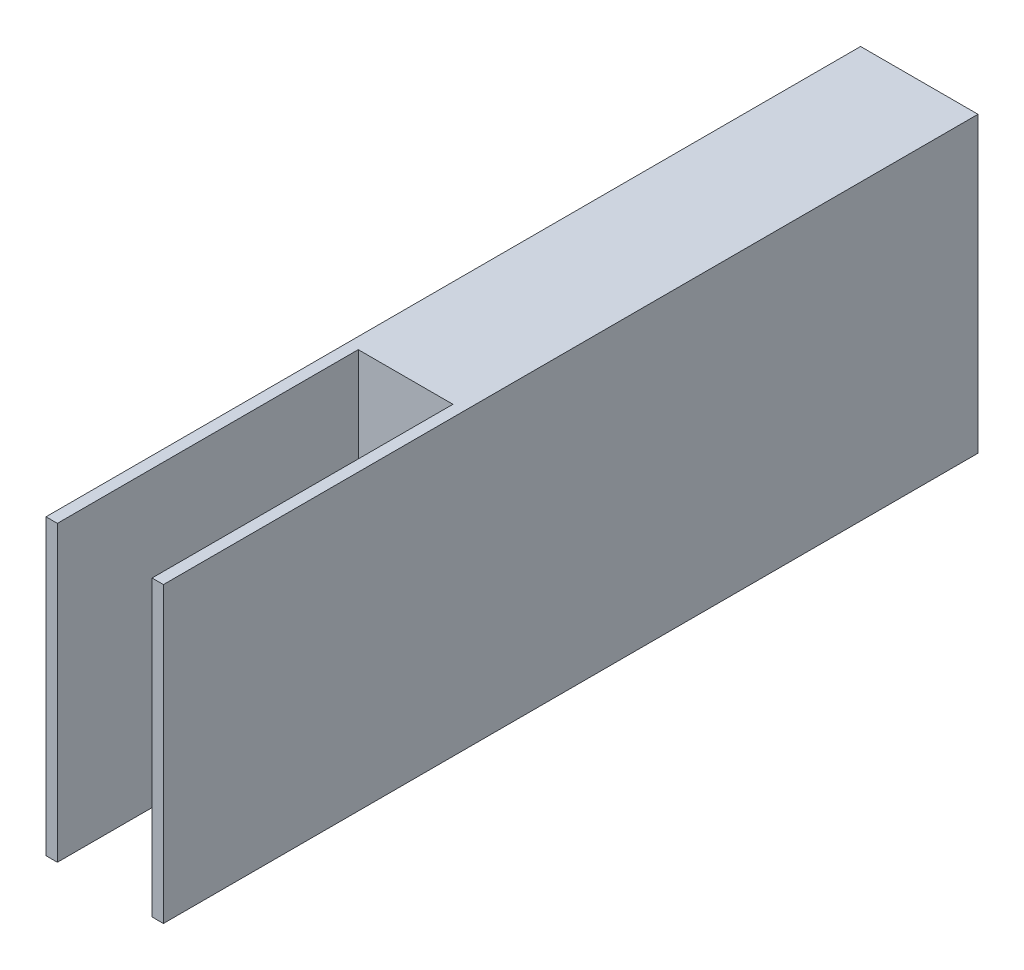
ISO-10303-21;
HEADER;
FILE_DESCRIPTION(('STEP AP214'),'2;1');
FILE_NAME('part.step','',(''),(''),'','','');
FILE_SCHEMA(('AUTOMOTIVE_DESIGN { 1 0 10303 214 1 1 1 1 }'));
ENDSEC;
DATA;
#1=APPLICATION_CONTEXT('core data for automotive mechanical design processes');
#2=APPLICATION_PROTOCOL_DEFINITION('international standard','automotive_design',2000,#1);
#3=PRODUCT_CONTEXT('',#1,'mechanical');
#4=PRODUCT('Part','Part','',(#3));
#5=PRODUCT_RELATED_PRODUCT_CATEGORY('part','',(#4));
#6=PRODUCT_DEFINITION_FORMATION('','',#4);
#7=PRODUCT_DEFINITION_CONTEXT('part definition',#1,'design');
#8=PRODUCT_DEFINITION('design','',#6,#7);
#9=PRODUCT_DEFINITION_SHAPE('','',#8);
#10=(LENGTH_UNIT() NAMED_UNIT(*) SI_UNIT(.MILLI.,.METRE.));
#11=(NAMED_UNIT(*) PLANE_ANGLE_UNIT() SI_UNIT($,.RADIAN.));
#12=(NAMED_UNIT(*) SI_UNIT($,.STERADIAN.) SOLID_ANGLE_UNIT());
#13=UNCERTAINTY_MEASURE_WITH_UNIT(LENGTH_MEASURE(1.E-05),#10,'distance_accuracy_value','');
#14=(GEOMETRIC_REPRESENTATION_CONTEXT(3) GLOBAL_UNCERTAINTY_ASSIGNED_CONTEXT((#13)) GLOBAL_UNIT_ASSIGNED_CONTEXT((#10,
#11,#12)) REPRESENTATION_CONTEXT('',''));
#15=CARTESIAN_POINT('',(0.,0.,0.));
#16=DIRECTION('',(0.,0.,1.));
#17=DIRECTION('',(1.,0.,0.));
#18=AXIS2_PLACEMENT_3D('',#15,#16,#17);
#19=CARTESIAN_POINT('',(0.,0.,35.));
#20=DIRECTION('',(0.,0.,1.));
#21=DIRECTION('',(1.,0.,0.));
#22=AXIS2_PLACEMENT_3D('',#19,#20,#21);
#23=PLANE('',#22);
#24=DIRECTION('',(1.,0.,0.));
#25=VECTOR('',#24,1.);
#26=CARTESIAN_POINT('',(-4.3693627613674,-13.5173913043478,35.));
#27=LINE('',#26,#25);
#28=CARTESIAN_POINT('',(-3.5943627613674,-13.5173913043478,35.));
#29=VERTEX_POINT('',#28);
#30=CARTESIAN_POINT('',(2.8556372386326,-13.5173913043478,35.));
#31=VERTEX_POINT('',#30);
#32=EDGE_CURVE('E60',#29,#31,#27,.T.);
#33=ORIENTED_EDGE('',*,*,#32,.T.);
#34=DIRECTION('',(0.,-1.,0.));
#35=VECTOR('',#34,1.);
#36=CARTESIAN_POINT('',(2.8556372386326,-13.5173913043478,35.));
#37=LINE('',#36,#35);
#38=CARTESIAN_POINT('',(2.8556372386326,6.48260869565218,35.));
#39=VERTEX_POINT('',#38);
#40=EDGE_CURVE('E55',#39,#31,#37,.T.);
#41=ORIENTED_EDGE('',*,*,#40,.F.);
#42=DIRECTION('',(-1.,0.,0.));
#43=VECTOR('',#42,1.);
#44=CARTESIAN_POINT('',(-4.3693627613674,6.48260869565218,35.));
#45=LINE('',#44,#43);
#46=CARTESIAN_POINT('',(-3.5943627613674,6.48260869565218,35.));
#47=VERTEX_POINT('',#46);
#48=EDGE_CURVE('E174',#39,#47,#45,.T.);
#49=ORIENTED_EDGE('',*,*,#48,.T.);
#50=DIRECTION('',(0.,1.,0.));
#51=VECTOR('',#50,1.);
#52=CARTESIAN_POINT('',(-3.5943627613674,6.48260869565218,35.));
#53=LINE('',#52,#51);
#54=EDGE_CURVE('E145',#29,#47,#53,.T.);
#55=ORIENTED_EDGE('',*,*,#54,.F.);
#56=EDGE_LOOP('',(#33,#41,#49,#55));
#57=FACE_BOUND('',#56,.T.);
#58=ADVANCED_FACE('F39',(#57),#23,.T.);
#59=CARTESIAN_POINT('',(-4.3693627613674,6.48260869565218,35.));
#60=DIRECTION('',(1.,0.,0.));
#61=DIRECTION('',(0.,1.,0.));
#62=AXIS2_PLACEMENT_3D('',#59,#60,#61);
#63=PLANE('',#62);
#64=DIRECTION('',(0.,-1.,0.));
#65=VECTOR('',#64,1.);
#66=CARTESIAN_POINT('',(-4.3693627613674,6.48260869565218,0.));
#67=LINE('',#66,#65);
#68=CARTESIAN_POINT('',(-4.3693627613674,6.48260869565218,0.));
#69=VERTEX_POINT('',#68);
#70=CARTESIAN_POINT('',(-4.3693627613674,-13.5173913043478,0.));
#71=VERTEX_POINT('',#70);
#72=EDGE_CURVE('E171',#69,#71,#67,.T.);
#73=ORIENTED_EDGE('',*,*,#72,.T.);
#74=DIRECTION('',(0.,0.,-1.));
#75=VECTOR('',#74,1.);
#76=CARTESIAN_POINT('',(-4.3693627613674,-13.5173913043478,35.));
#77=LINE('',#76,#75);
#78=CARTESIAN_POINT('',(-4.3693627613674,-13.5173913043478,55.5));
#79=VERTEX_POINT('',#78);
#80=EDGE_CURVE('E11',#79,#71,#77,.T.);
#81=ORIENTED_EDGE('',*,*,#80,.F.);
#82=DIRECTION('',(0.,-1.,0.));
#83=VECTOR('',#82,1.);
#84=CARTESIAN_POINT('',(-4.3693627613674,6.48260869565218,55.5));
#85=LINE('',#84,#83);
#86=CARTESIAN_POINT('',(-4.3693627613674,6.48260869565218,55.5));
#87=VERTEX_POINT('',#86);
#88=EDGE_CURVE('E146',#87,#79,#85,.T.);
#89=ORIENTED_EDGE('',*,*,#88,.F.);
#90=DIRECTION('',(0.,0.,-1.));
#91=VECTOR('',#90,1.);
#92=CARTESIAN_POINT('',(-4.3693627613674,6.48260869565218,35.));
#93=LINE('',#92,#91);
#94=EDGE_CURVE('E114',#87,#69,#93,.T.);
#95=ORIENTED_EDGE('',*,*,#94,.T.);
#96=EDGE_LOOP('',(#73,#81,#89,#95));
#97=FACE_BOUND('',#96,.T.);
#98=ADVANCED_FACE('F41',(#97),#63,.F.);
#99=CARTESIAN_POINT('',(-4.3693627613674,-13.5173913043478,35.));
#100=DIRECTION('',(0.,1.,0.));
#101=DIRECTION('',(0.,0.,1.));
#102=AXIS2_PLACEMENT_3D('',#99,#100,#101);
#103=PLANE('',#102);
#104=DIRECTION('',(1.,0.,0.));
#105=VECTOR('',#104,1.);
#106=CARTESIAN_POINT('',(-4.3693627613674,-13.5173913043478,0.));
#107=LINE('',#106,#105);
#108=CARTESIAN_POINT('',(3.6306372386326,-13.5173913043478,0.));
#109=VERTEX_POINT('',#108);
#110=EDGE_CURVE('E181',#71,#109,#107,.T.);
#111=ORIENTED_EDGE('',*,*,#110,.T.);
#112=DIRECTION('',(0.,0.,-1.));
#113=VECTOR('',#112,1.);
#114=CARTESIAN_POINT('',(3.6306372386326,-13.5173913043478,35.));
#115=LINE('',#114,#113);
#116=CARTESIAN_POINT('',(3.6306372386326,-13.5173913043478,55.5));
#117=VERTEX_POINT('',#116);
#118=EDGE_CURVE('E48',#117,#109,#115,.T.);
#119=ORIENTED_EDGE('',*,*,#118,.F.);
#120=DIRECTION('',(1.,0.,0.));
#121=VECTOR('',#120,1.);
#122=CARTESIAN_POINT('',(3.6306372386326,-13.5173913043478,55.5));
#123=LINE('',#122,#121);
#124=CARTESIAN_POINT('',(2.8556372386326,-13.5173913043478,55.5));
#125=VERTEX_POINT('',#124);
#126=EDGE_CURVE('E129',#125,#117,#123,.T.);
#127=ORIENTED_EDGE('',*,*,#126,.F.);
#128=DIRECTION('',(0.,0.,-1.));
#129=VECTOR('',#128,1.);
#130=CARTESIAN_POINT('',(2.8556372386326,-13.5173913043478,55.5));
#131=LINE('',#130,#129);
#132=EDGE_CURVE('E138',#125,#31,#131,.T.);
#133=ORIENTED_EDGE('',*,*,#132,.T.);
#134=ORIENTED_EDGE('',*,*,#32,.F.);
#135=DIRECTION('',(0.,0.,-1.));
#136=VECTOR('',#135,1.);
#137=CARTESIAN_POINT('',(-3.5943627613674,-13.5173913043478,55.5));
#138=LINE('',#137,#136);
#139=CARTESIAN_POINT('',(-3.5943627613674,-13.5173913043478,55.5));
#140=VERTEX_POINT('',#139);
#141=EDGE_CURVE('E167',#140,#29,#138,.T.);
#142=ORIENTED_EDGE('',*,*,#141,.F.);
#143=DIRECTION('',(1.,0.,0.));
#144=VECTOR('',#143,1.);
#145=CARTESIAN_POINT('',(-4.3693627613674,-13.5173913043478,55.5));
#146=LINE('',#145,#144);
#147=EDGE_CURVE('E150',#79,#140,#146,.T.);
#148=ORIENTED_EDGE('',*,*,#147,.F.);
#149=ORIENTED_EDGE('',*,*,#80,.T.);
#150=EDGE_LOOP('',(#111,#119,#127,#133,#134,#142,#148,#149));
#151=FACE_BOUND('',#150,.T.);
#152=ADVANCED_FACE('F206',(#151),#103,.F.);
#153=CARTESIAN_POINT('',(3.6306372386326,6.48260869565218,35.));
#154=DIRECTION('',(-1.,0.,0.));
#155=DIRECTION('',(0.,-1.,0.));
#156=AXIS2_PLACEMENT_3D('',#153,#154,#155);
#157=PLANE('',#156);
#158=DIRECTION('',(0.,1.,0.));
#159=VECTOR('',#158,1.);
#160=CARTESIAN_POINT('',(3.6306372386326,6.48260869565218,0.));
#161=LINE('',#160,#159);
#162=CARTESIAN_POINT('',(3.6306372386326,6.48260869565218,0.));
#163=VERTEX_POINT('',#162);
#164=EDGE_CURVE('E110',#109,#163,#161,.T.);
#165=ORIENTED_EDGE('',*,*,#164,.T.);
#166=DIRECTION('',(0.,0.,-1.));
#167=VECTOR('',#166,1.);
#168=CARTESIAN_POINT('',(3.6306372386326,6.48260869565218,35.));
#169=LINE('',#168,#167);
#170=CARTESIAN_POINT('',(3.6306372386326,6.48260869565218,55.5));
#171=VERTEX_POINT('',#170);
#172=EDGE_CURVE('E103',#171,#163,#169,.T.);
#173=ORIENTED_EDGE('',*,*,#172,.F.);
#174=DIRECTION('',(0.,1.,0.));
#175=VECTOR('',#174,1.);
#176=CARTESIAN_POINT('',(3.6306372386326,-13.5173913043478,55.5));
#177=LINE('',#176,#175);
#178=EDGE_CURVE('E108',#117,#171,#177,.T.);
#179=ORIENTED_EDGE('',*,*,#178,.F.);
#180=ORIENTED_EDGE('',*,*,#118,.T.);
#181=EDGE_LOOP('',(#165,#173,#179,#180));
#182=FACE_BOUND('',#181,.T.);
#183=ADVANCED_FACE('F105',(#182),#157,.F.);
#184=CARTESIAN_POINT('',(-4.3693627613674,6.48260869565218,35.));
#185=DIRECTION('',(0.,-1.,0.));
#186=DIRECTION('',(0.,0.,-1.));
#187=AXIS2_PLACEMENT_3D('',#184,#185,#186);
#188=PLANE('',#187);
#189=DIRECTION('',(-1.,0.,0.));
#190=VECTOR('',#189,1.);
#191=CARTESIAN_POINT('',(-4.3693627613674,6.48260869565218,0.));
#192=LINE('',#191,#190);
#193=EDGE_CURVE('E175',#163,#69,#192,.T.);
#194=ORIENTED_EDGE('',*,*,#193,.T.);
#195=ORIENTED_EDGE('',*,*,#94,.F.);
#196=DIRECTION('',(-1.,0.,0.));
#197=VECTOR('',#196,1.);
#198=CARTESIAN_POINT('',(-4.3693627613674,6.48260869565218,55.5));
#199=LINE('',#198,#197);
#200=CARTESIAN_POINT('',(-3.5943627613674,6.48260869565218,55.5));
#201=VERTEX_POINT('',#200);
#202=EDGE_CURVE('E156',#201,#87,#199,.T.);
#203=ORIENTED_EDGE('',*,*,#202,.F.);
#204=DIRECTION('',(0.,0.,-1.));
#205=VECTOR('',#204,1.);
#206=CARTESIAN_POINT('',(-3.5943627613674,6.48260869565218,55.5));
#207=LINE('',#206,#205);
#208=EDGE_CURVE('E160',#201,#47,#207,.T.);
#209=ORIENTED_EDGE('',*,*,#208,.T.);
#210=ORIENTED_EDGE('',*,*,#48,.F.);
#211=DIRECTION('',(0.,0.,-1.));
#212=VECTOR('',#211,1.);
#213=CARTESIAN_POINT('',(2.8556372386326,6.48260869565218,55.5));
#214=LINE('',#213,#212);
#215=CARTESIAN_POINT('',(2.8556372386326,6.48260869565218,55.5));
#216=VERTEX_POINT('',#215);
#217=EDGE_CURVE('E120',#216,#39,#214,.T.);
#218=ORIENTED_EDGE('',*,*,#217,.F.);
#219=DIRECTION('',(-1.,0.,0.));
#220=VECTOR('',#219,1.);
#221=CARTESIAN_POINT('',(3.6306372386326,6.48260869565218,55.5));
#222=LINE('',#221,#220);
#223=EDGE_CURVE('E117',#171,#216,#222,.T.);
#224=ORIENTED_EDGE('',*,*,#223,.F.);
#225=ORIENTED_EDGE('',*,*,#172,.T.);
#226=EDGE_LOOP('',(#194,#195,#203,#209,#210,#218,#224,#225));
#227=FACE_BOUND('',#226,.T.);
#228=ADVANCED_FACE('F118',(#227),#188,.F.);
#229=CARTESIAN_POINT('',(0.,0.,0.));
#230=DIRECTION('',(0.,0.,1.));
#231=DIRECTION('',(1.,0.,0.));
#232=AXIS2_PLACEMENT_3D('',#229,#230,#231);
#233=PLANE('',#232);
#234=ORIENTED_EDGE('',*,*,#72,.F.);
#235=ORIENTED_EDGE('',*,*,#193,.F.);
#236=ORIENTED_EDGE('',*,*,#164,.F.);
#237=ORIENTED_EDGE('',*,*,#110,.F.);
#238=EDGE_LOOP('',(#234,#235,#236,#237));
#239=FACE_BOUND('',#238,.T.);
#240=ADVANCED_FACE('F194',(#239),#233,.F.);
#241=CARTESIAN_POINT('',(-3.5943627613674,6.48260869565218,55.5));
#242=DIRECTION('',(-1.,0.,0.));
#243=DIRECTION('',(0.,-1.,0.));
#244=AXIS2_PLACEMENT_3D('',#241,#242,#243);
#245=PLANE('',#244);
#246=ORIENTED_EDGE('',*,*,#54,.T.);
#247=ORIENTED_EDGE('',*,*,#208,.F.);
#248=DIRECTION('',(0.,1.,0.));
#249=VECTOR('',#248,1.);
#250=CARTESIAN_POINT('',(-3.5943627613674,6.48260869565218,55.5));
#251=LINE('',#250,#249);
#252=EDGE_CURVE('E153',#140,#201,#251,.T.);
#253=ORIENTED_EDGE('',*,*,#252,.F.);
#254=ORIENTED_EDGE('',*,*,#141,.T.);
#255=EDGE_LOOP('',(#246,#247,#253,#254));
#256=FACE_BOUND('',#255,.T.);
#257=ADVANCED_FACE('F205',(#256),#245,.F.);
#258=CARTESIAN_POINT('',(0.,0.,55.5));
#259=DIRECTION('',(0.,0.,1.));
#260=DIRECTION('',(1.,0.,0.));
#261=AXIS2_PLACEMENT_3D('',#258,#259,#260);
#262=PLANE('',#261);
#263=ORIENTED_EDGE('',*,*,#88,.T.);
#264=ORIENTED_EDGE('',*,*,#147,.T.);
#265=ORIENTED_EDGE('',*,*,#252,.T.);
#266=ORIENTED_EDGE('',*,*,#202,.T.);
#267=EDGE_LOOP('',(#263,#264,#265,#266));
#268=FACE_BOUND('',#267,.T.);
#269=ADVANCED_FACE('F200',(#268),#262,.T.);
#270=CARTESIAN_POINT('',(2.8556372386326,-13.5173913043478,55.5));
#271=DIRECTION('',(1.,0.,0.));
#272=DIRECTION('',(0.,0.,-1.));
#273=AXIS2_PLACEMENT_3D('',#270,#271,#272);
#274=PLANE('',#273);
#275=ORIENTED_EDGE('',*,*,#40,.T.);
#276=ORIENTED_EDGE('',*,*,#132,.F.);
#277=DIRECTION('',(0.,-1.,0.));
#278=VECTOR('',#277,1.);
#279=CARTESIAN_POINT('',(2.8556372386326,-13.5173913043478,55.5));
#280=LINE('',#279,#278);
#281=EDGE_CURVE('E124',#216,#125,#280,.T.);
#282=ORIENTED_EDGE('',*,*,#281,.F.);
#283=ORIENTED_EDGE('',*,*,#217,.T.);
#284=EDGE_LOOP('',(#275,#276,#282,#283));
#285=FACE_BOUND('',#284,.T.);
#286=ADVANCED_FACE('F209',(#285),#274,.F.);
#287=CARTESIAN_POINT('',(0.,0.,55.5));
#288=DIRECTION('',(0.,0.,1.));
#289=DIRECTION('',(1.,0.,0.));
#290=AXIS2_PLACEMENT_3D('',#287,#288,#289);
#291=PLANE('',#290);
#292=ORIENTED_EDGE('',*,*,#178,.T.);
#293=ORIENTED_EDGE('',*,*,#223,.T.);
#294=ORIENTED_EDGE('',*,*,#281,.T.);
#295=ORIENTED_EDGE('',*,*,#126,.T.);
#296=EDGE_LOOP('',(#292,#293,#294,#295));
#297=FACE_BOUND('',#296,.T.);
#298=ADVANCED_FACE('F127',(#297),#291,.T.);
#299=CLOSED_SHELL('',(#58,#98,#152,#183,#228,#240,#257,#269,#286,#298));
#300=MANIFOLD_SOLID_BREP('B2',#299);
#301=ADVANCED_BREP_SHAPE_REPRESENTATION('',(#18,#300),#14);
#302=SHAPE_DEFINITION_REPRESENTATION(#9,#301);
ENDSEC;
END-ISO-10303-21;
